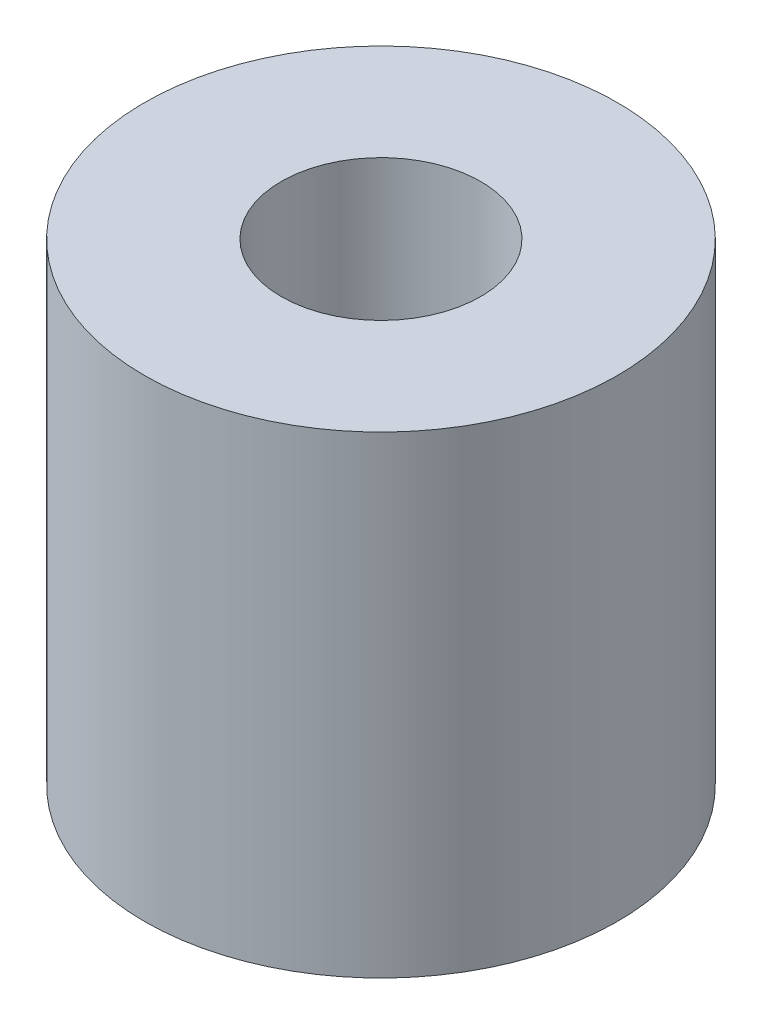
ISO-10303-21;
HEADER;
FILE_DESCRIPTION(('STEP AP214'),'2;1');
FILE_NAME('part.step','',(''),(''),'','','');
FILE_SCHEMA(('AUTOMOTIVE_DESIGN { 1 0 10303 214 1 1 1 1 }'));
ENDSEC;
DATA;
#1=APPLICATION_CONTEXT('core data for automotive mechanical design processes');
#2=APPLICATION_PROTOCOL_DEFINITION('international standard','automotive_design',2000,#1);
#3=PRODUCT_CONTEXT('',#1,'mechanical');
#4=PRODUCT('Part','Part','',(#3));
#5=PRODUCT_RELATED_PRODUCT_CATEGORY('part','',(#4));
#6=PRODUCT_DEFINITION_FORMATION('','',#4);
#7=PRODUCT_DEFINITION_CONTEXT('part definition',#1,'design');
#8=PRODUCT_DEFINITION('design','',#6,#7);
#9=PRODUCT_DEFINITION_SHAPE('','',#8);
#10=(LENGTH_UNIT() NAMED_UNIT(*) SI_UNIT(.MILLI.,.METRE.));
#11=(NAMED_UNIT(*) PLANE_ANGLE_UNIT() SI_UNIT($,.RADIAN.));
#12=(NAMED_UNIT(*) SI_UNIT($,.STERADIAN.) SOLID_ANGLE_UNIT());
#13=UNCERTAINTY_MEASURE_WITH_UNIT(LENGTH_MEASURE(1.E-05),#10,'distance_accuracy_value','');
#14=(GEOMETRIC_REPRESENTATION_CONTEXT(3) GLOBAL_UNCERTAINTY_ASSIGNED_CONTEXT((#13)) GLOBAL_UNIT_ASSIGNED_CONTEXT((#10,
#11,#12)) REPRESENTATION_CONTEXT('',''));
#15=CARTESIAN_POINT('',(0.,0.,0.));
#16=DIRECTION('',(0.,0.,1.));
#17=DIRECTION('',(1.,0.,0.));
#18=AXIS2_PLACEMENT_3D('',#15,#16,#17);
#19=CARTESIAN_POINT('',(0.,25.4,0.));
#20=DIRECTION('',(0.,-1.,0.));
#21=DIRECTION('',(0.,0.,-1.));
#22=AXIS2_PLACEMENT_3D('',#19,#20,#21);
#23=CYLINDRICAL_SURFACE('',#22,12.7);
#24=CARTESIAN_POINT('',(0.,25.4,0.));
#25=DIRECTION('',(0.,1.,0.));
#26=DIRECTION('',(0.,0.,1.));
#27=AXIS2_PLACEMENT_3D('',#24,#25,#26);
#28=CIRCLE('',#27,12.7);
#29=CARTESIAN_POINT('',(0.,25.4,12.7));
#30=VERTEX_POINT('',#29);
#31=EDGE_CURVE('E10',#30,#30,#28,.T.);
#32=ORIENTED_EDGE('',*,*,#31,.F.);
#33=EDGE_LOOP('',(#32));
#34=FACE_BOUND('',#33,.T.);
#35=CARTESIAN_POINT('',(0.,0.,0.));
#36=DIRECTION('',(0.,1.,0.));
#37=DIRECTION('',(0.,0.,1.));
#38=AXIS2_PLACEMENT_3D('',#35,#36,#37);
#39=CIRCLE('',#38,12.7);
#40=CARTESIAN_POINT('',(0.,0.,12.7));
#41=VERTEX_POINT('',#40);
#42=EDGE_CURVE('E52',#41,#41,#39,.T.);
#43=ORIENTED_EDGE('',*,*,#42,.T.);
#44=EDGE_LOOP('',(#43));
#45=FACE_BOUND('',#44,.T.);
#46=ADVANCED_FACE('F49',(#34,#45),#23,.T.);
#47=CARTESIAN_POINT('',(0.,25.4,0.));
#48=DIRECTION('',(0.,1.,0.));
#49=DIRECTION('',(0.,0.,1.));
#50=AXIS2_PLACEMENT_3D('',#47,#48,#49);
#51=PLANE('',#50);
#52=CARTESIAN_POINT('',(0.,25.4,0.));
#53=DIRECTION('',(0.,1.,0.));
#54=DIRECTION('',(0.,0.,1.));
#55=AXIS2_PLACEMENT_3D('',#52,#53,#54);
#56=CIRCLE('',#55,5.35813);
#57=CARTESIAN_POINT('',(0.,25.4,5.35813));
#58=VERTEX_POINT('',#57);
#59=EDGE_CURVE('E67',#58,#58,#56,.T.);
#60=ORIENTED_EDGE('',*,*,#59,.F.);
#61=EDGE_LOOP('',(#60));
#62=FACE_BOUND('',#61,.T.);
#63=ORIENTED_EDGE('',*,*,#31,.T.);
#64=EDGE_LOOP('',(#63));
#65=FACE_BOUND('',#64,.T.);
#66=ADVANCED_FACE('F75',(#62,#65),#51,.T.);
#67=CARTESIAN_POINT('',(0.,0.,0.));
#68=DIRECTION('',(0.,1.,0.));
#69=DIRECTION('',(0.,0.,1.));
#70=AXIS2_PLACEMENT_3D('',#67,#68,#69);
#71=PLANE('',#70);
#72=CARTESIAN_POINT('',(0.,0.,0.));
#73=DIRECTION('',(0.,1.,0.));
#74=DIRECTION('',(0.,0.,1.));
#75=AXIS2_PLACEMENT_3D('',#72,#73,#74);
#76=CIRCLE('',#75,5.35812999999999);
#77=CARTESIAN_POINT('',(0.,0.,5.35812999999999));
#78=VERTEX_POINT('',#77);
#79=EDGE_CURVE('E62',#78,#78,#76,.T.);
#80=ORIENTED_EDGE('',*,*,#79,.T.);
#81=EDGE_LOOP('',(#80));
#82=FACE_BOUND('',#81,.T.);
#83=ORIENTED_EDGE('',*,*,#42,.F.);
#84=EDGE_LOOP('',(#83));
#85=FACE_BOUND('',#84,.T.);
#86=ADVANCED_FACE('F77',(#82,#85),#71,.F.);
#87=CARTESIAN_POINT('',(0.,25.4,0.));
#88=DIRECTION('',(0.,1.,0.));
#89=DIRECTION('',(0.,0.,1.));
#90=AXIS2_PLACEMENT_3D('',#87,#88,#89);
#91=CYLINDRICAL_SURFACE('',#90,5.35813);
#92=ORIENTED_EDGE('',*,*,#79,.F.);
#93=EDGE_LOOP('',(#92));
#94=FACE_BOUND('',#93,.T.);
#95=ORIENTED_EDGE('',*,*,#59,.T.);
#96=EDGE_LOOP('',(#95));
#97=FACE_BOUND('',#96,.T.);
#98=ADVANCED_FACE('F73',(#94,#97),#91,.F.);
#99=CLOSED_SHELL('',(#46,#66,#86,#98));
#100=MANIFOLD_SOLID_BREP('B2',#99);
#101=ADVANCED_BREP_SHAPE_REPRESENTATION('',(#18,#100),#14);
#102=SHAPE_DEFINITION_REPRESENTATION(#9,#101);
ENDSEC;
END-ISO-10303-21;
